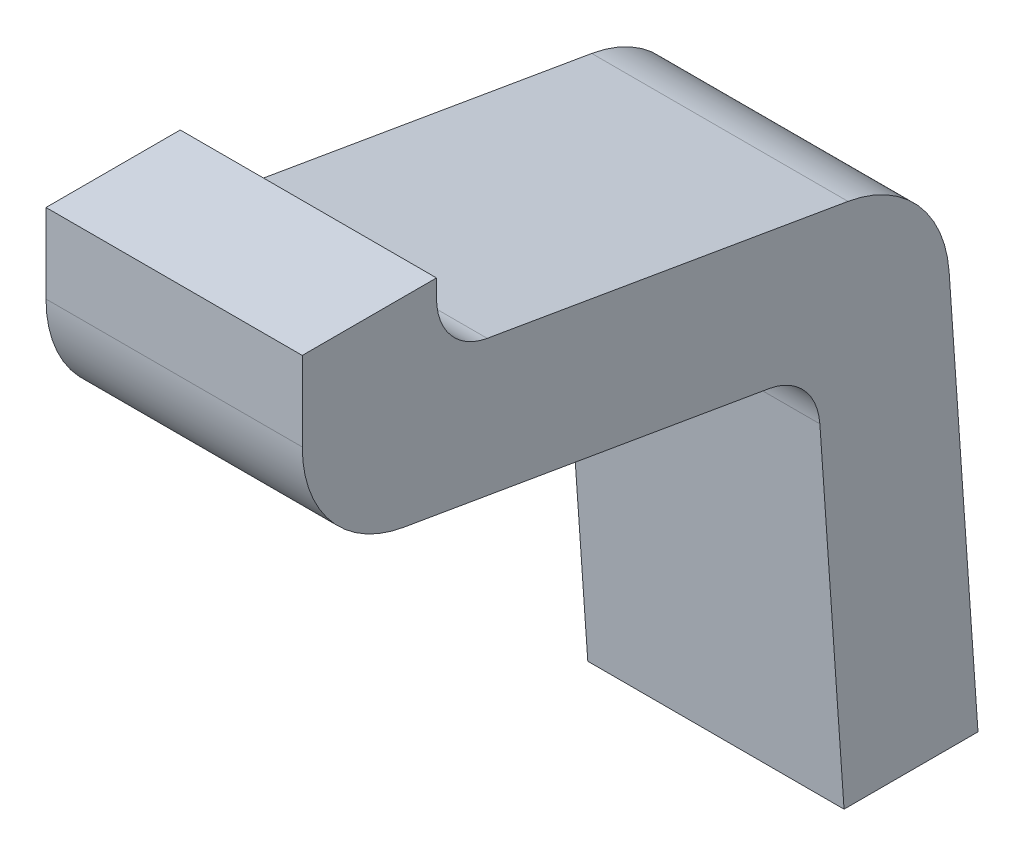
ISO-10303-21;
HEADER;
FILE_DESCRIPTION(('STEP AP214'),'2;1');
FILE_NAME('part.step','',(''),(''),'','','');
FILE_SCHEMA(('AUTOMOTIVE_DESIGN { 1 0 10303 214 1 1 1 1 }'));
ENDSEC;
DATA;
#1=APPLICATION_CONTEXT('core data for automotive mechanical design processes');
#2=APPLICATION_PROTOCOL_DEFINITION('international standard','automotive_design',2000,#1);
#3=PRODUCT_CONTEXT('',#1,'mechanical');
#4=PRODUCT('Part','Part','',(#3));
#5=PRODUCT_RELATED_PRODUCT_CATEGORY('part','',(#4));
#6=PRODUCT_DEFINITION_FORMATION('','',#4);
#7=PRODUCT_DEFINITION_CONTEXT('part definition',#1,'design');
#8=PRODUCT_DEFINITION('design','',#6,#7);
#9=PRODUCT_DEFINITION_SHAPE('','',#8);
#10=(LENGTH_UNIT() NAMED_UNIT(*) SI_UNIT(.MILLI.,.METRE.));
#11=(NAMED_UNIT(*) PLANE_ANGLE_UNIT() SI_UNIT($,.RADIAN.));
#12=(NAMED_UNIT(*) SI_UNIT($,.STERADIAN.) SOLID_ANGLE_UNIT());
#13=UNCERTAINTY_MEASURE_WITH_UNIT(LENGTH_MEASURE(1.E-05),#10,'distance_accuracy_value','');
#14=(GEOMETRIC_REPRESENTATION_CONTEXT(3) GLOBAL_UNCERTAINTY_ASSIGNED_CONTEXT((#13)) GLOBAL_UNIT_ASSIGNED_CONTEXT((#10,
#11,#12)) REPRESENTATION_CONTEXT('',''));
#15=CARTESIAN_POINT('',(0.,0.,0.));
#16=DIRECTION('',(0.,0.,1.));
#17=DIRECTION('',(1.,0.,0.));
#18=AXIS2_PLACEMENT_3D('',#15,#16,#17);
#19=CARTESIAN_POINT('',(-2.75,-3.,0.));
#20=DIRECTION('',(0.,-1.,0.));
#21=DIRECTION('',(1.,0.,0.));
#22=AXIS2_PLACEMENT_3D('',#19,#20,#21);
#23=PLANE('',#22);
#24=DIRECTION('',(1.,0.,0.));
#25=VECTOR('',#24,1.);
#26=CARTESIAN_POINT('',(-0.635,-3.,0.219534775679777));
#27=LINE('',#26,#25);
#28=CARTESIAN_POINT('',(-2.75,-3.,0.219534775679777));
#29=VERTEX_POINT('',#28);
#30=CARTESIAN_POINT('',(-2.33,-3.,0.219534775679777));
#31=VERTEX_POINT('',#30);
#32=EDGE_CURVE('E11',#29,#31,#27,.T.);
#33=ORIENTED_EDGE('',*,*,#32,.F.);
#34=DIRECTION('',(0.,0.,1.));
#35=VECTOR('',#34,1.);
#36=CARTESIAN_POINT('',(-2.75,-3.,0.));
#37=LINE('',#36,#35);
#38=CARTESIAN_POINT('',(-2.75,-3.,0.));
#39=VERTEX_POINT('',#38);
#40=EDGE_CURVE('E24',#39,#29,#37,.T.);
#41=ORIENTED_EDGE('',*,*,#40,.F.);
#42=DIRECTION('',(1.,0.,0.));
#43=VECTOR('',#42,1.);
#44=CARTESIAN_POINT('',(-2.75,-3.,0.));
#45=LINE('',#44,#43);
#46=CARTESIAN_POINT('',(-2.33,-3.,0.));
#47=VERTEX_POINT('',#46);
#48=EDGE_CURVE('E199',#39,#47,#45,.T.);
#49=ORIENTED_EDGE('',*,*,#48,.T.);
#50=DIRECTION('',(0.,0.,1.));
#51=VECTOR('',#50,1.);
#52=CARTESIAN_POINT('',(-2.33,-3.,0.));
#53=LINE('',#52,#51);
#54=EDGE_CURVE('E197',#47,#31,#53,.T.);
#55=ORIENTED_EDGE('',*,*,#54,.T.);
#56=EDGE_LOOP('',(#33,#41,#49,#55));
#57=FACE_BOUND('',#56,.T.);
#58=ADVANCED_FACE('F17',(#57),#23,.T.);
#59=CARTESIAN_POINT('',(1.48,-2.167034018033,0.0582466555763446));
#60=DIRECTION('',(0.,0.985646729541637,-0.168820983719071));
#61=DIRECTION('',(0.,0.168820983719071,0.985646729541637));
#62=AXIS2_PLACEMENT_3D('',#59,#60,#61);
#63=PLANE('',#62);
#64=DIRECTION('',(1.,0.,0.));
#65=VECTOR('',#64,1.);
#66=CARTESIAN_POINT('',(1.48,-2.140521076001,0.213040177260404));
#67=LINE('',#66,#65);
#68=CARTESIAN_POINT('',(-2.75,-2.140521076001,0.213040177260404));
#69=VERTEX_POINT('',#68);
#70=CARTESIAN_POINT('',(-2.33,-2.140521076001,0.213040177260404));
#71=VERTEX_POINT('',#70);
#72=EDGE_CURVE('E195',#69,#71,#67,.T.);
#73=ORIENTED_EDGE('',*,*,#72,.F.);
#74=DIRECTION('',(0.,0.168820983719071,0.985646729541637));
#75=VECTOR('',#74,1.);
#76=CARTESIAN_POINT('',(-2.75,-2.098248487251,0.459845034887286));
#77=LINE('',#76,#75);
#78=CARTESIAN_POINT('',(-2.75,-2.039236384596,0.804382098371907));
#79=VERTEX_POINT('',#78);
#80=EDGE_CURVE('E193',#69,#79,#77,.T.);
#81=ORIENTED_EDGE('',*,*,#80,.T.);
#82=DIRECTION('',(-1.,0.,0.));
#83=VECTOR('',#82,1.);
#84=CARTESIAN_POINT('',(1.48,-2.039236384596,0.804382098371907));
#85=LINE('',#84,#83);
#86=CARTESIAN_POINT('',(-2.33,-2.039236384596,0.804382098371907));
#87=VERTEX_POINT('',#86);
#88=EDGE_CURVE('E190',#87,#79,#85,.T.);
#89=ORIENTED_EDGE('',*,*,#88,.F.);
#90=DIRECTION('',(0.,-0.168820983719071,-0.985646729541637));
#91=VECTOR('',#90,1.);
#92=CARTESIAN_POINT('',(-2.33,-2.183750060882,-0.0393485165548266));
#93=LINE('',#92,#91);
#94=EDGE_CURVE('E187',#87,#71,#93,.T.);
#95=ORIENTED_EDGE('',*,*,#94,.T.);
#96=EDGE_LOOP('',(#73,#81,#89,#95));
#97=FACE_BOUND('',#96,.T.);
#98=ADVANCED_FACE('F243',(#97),#63,.T.);
#99=CARTESIAN_POINT('',(1.48,-2.182310685783,0.276713182583246));
#100=DIRECTION('',(0.,-0.069756473744126,0.997564050259824));
#101=DIRECTION('',(0.,-0.997564050259824,-0.069756473744126));
#102=AXIS2_PLACEMENT_3D('',#99,#100,#101);
#103=PLANE('',#102);
#104=DIRECTION('',(1.,0.,0.));
#105=VECTOR('',#104,1.);
#106=CARTESIAN_POINT('',(1.48,-2.433240926539,0.259166430826985));
#107=LINE('',#106,#105);
#108=CARTESIAN_POINT('',(-2.75,-2.433240926539,0.259166430826985));
#109=VERTEX_POINT('',#108);
#110=CARTESIAN_POINT('',(-2.33,-2.433240926539,0.259166430826985));
#111=VERTEX_POINT('',#110);
#112=EDGE_CURVE('E185',#109,#111,#107,.T.);
#113=ORIENTED_EDGE('',*,*,#112,.F.);
#114=DIRECTION('',(0.,-0.997564050259824,-0.069756473744126));
#115=VECTOR('',#114,1.);
#116=CARTESIAN_POINT('',(-2.75,0.386608426345868,0.456349506235173));
#117=LINE('',#116,#115);
#118=EDGE_CURVE('E183',#109,#29,#117,.T.);
#119=ORIENTED_EDGE('',*,*,#118,.T.);
#120=ORIENTED_EDGE('',*,*,#32,.T.);
#121=DIRECTION('',(0.,0.997564050259824,0.069756473744126));
#122=VECTOR('',#121,1.);
#123=CARTESIAN_POINT('',(-2.33,-2.598793676766,0.247589854795074));
#124=LINE('',#123,#122);
#125=EDGE_CURVE('E181',#31,#111,#124,.T.);
#126=ORIENTED_EDGE('',*,*,#125,.T.);
#127=EDGE_LOOP('',(#113,#119,#120,#126));
#128=FACE_BOUND('',#127,.T.);
#129=ADVANCED_FACE('F205',(#128),#103,.T.);
#130=CARTESIAN_POINT('',(1.48,-2.21054449521,1.1075));
#131=DIRECTION('',(0.,-0.985646729541637,0.168820983719071));
#132=DIRECTION('',(0.,-0.168820983719071,-0.985646729541637));
#133=AXIS2_PLACEMENT_3D('',#130,#131,#132);
#134=PLANE('',#133);
#135=DIRECTION('',(1.,0.,0.));
#136=VECTOR('',#135,1.);
#137=CARTESIAN_POINT('',(-0.53,-2.239017264402,0.941264196743814));
#138=LINE('',#137,#136);
#139=CARTESIAN_POINT('',(-2.75,-2.239017264402,0.941264196743814));
#140=VERTEX_POINT('',#139);
#141=CARTESIAN_POINT('',(-2.33,-2.239017264402,0.941264196743814));
#142=VERTEX_POINT('',#141);
#143=EDGE_CURVE('E179',#140,#142,#138,.T.);
#144=ORIENTED_EDGE('',*,*,#143,.F.);
#145=DIRECTION('',(0.,-0.168820983719071,-0.985646729541637));
#146=VECTOR('',#145,1.);
#147=CARTESIAN_POINT('',(-2.75,-2.228435679277,1.003043867385));
#148=LINE('',#147,#146);
#149=CARTESIAN_POINT('',(-2.75,-2.341651900959,0.342040737481061));
#150=VERTEX_POINT('',#149);
#151=EDGE_CURVE('E177',#140,#150,#148,.T.);
#152=ORIENTED_EDGE('',*,*,#151,.T.);
#153=DIRECTION('',(-1.,0.,0.));
#154=VECTOR('',#153,1.);
#155=CARTESIAN_POINT('',(1.48,-2.341651900959,0.342040737481061));
#156=LINE('',#155,#154);
#157=CARTESIAN_POINT('',(-2.33,-2.341651900959,0.342040737481061));
#158=VERTEX_POINT('',#157);
#159=EDGE_CURVE('E174',#158,#150,#156,.T.);
#160=ORIENTED_EDGE('',*,*,#159,.F.);
#161=DIRECTION('',(0.,0.168820983719071,0.985646729541637));
#162=VECTOR('',#161,1.);
#163=CARTESIAN_POINT('',(-2.33,-2.313937252909,0.503850315942545));
#164=LINE('',#163,#162);
#165=EDGE_CURVE('E171',#158,#142,#164,.T.);
#166=ORIENTED_EDGE('',*,*,#165,.T.);
#167=EDGE_LOOP('',(#144,#152,#160,#166));
#168=FACE_BOUND('',#167,.T.);
#169=ADVANCED_FACE('F234',(#168),#134,.T.);
#170=CARTESIAN_POINT('',(1.48,-2.440216573913,0.358922835852968));
#171=DIRECTION('',(-1.,0.,0.));
#172=DIRECTION('',(0.,0.670949139623343,-0.741503372911207));
#173=AXIS2_PLACEMENT_3D('',#170,#171,#172);
#174=CYLINDRICAL_SURFACE('',#173,0.1);
#175=CARTESIAN_POINT('',(-2.33,-2.440216573913,0.358922835852968));
#176=DIRECTION('',(1.,0.,0.));
#177=DIRECTION('',(0.,0.670949139623343,-0.741503372911207));
#178=AXIS2_PLACEMENT_3D('',#175,#176,#177);
#179=CIRCLE('',#178,0.1);
#180=EDGE_CURVE('E168',#111,#158,#179,.T.);
#181=ORIENTED_EDGE('',*,*,#180,.T.);
#182=ORIENTED_EDGE('',*,*,#159,.T.);
#183=CARTESIAN_POINT('',(-2.75,-2.440216573913,0.358922835852968));
#184=DIRECTION('',(-1.,0.,0.));
#185=DIRECTION('',(0.,0.670949139623343,-0.741503372911207));
#186=AXIS2_PLACEMENT_3D('',#183,#184,#185);
#187=CIRCLE('',#186,0.1);
#188=EDGE_CURVE('E165',#150,#109,#187,.T.);
#189=ORIENTED_EDGE('',*,*,#188,.T.);
#190=ORIENTED_EDGE('',*,*,#112,.T.);
#191=EDGE_LOOP('',(#181,#182,#189,#190));
#192=FACE_BOUND('',#191,.T.);
#193=ADVANCED_FACE('F209',(#192),#174,.F.);
#194=CARTESIAN_POINT('',(1.48,-1.940671711642,0.7875));
#195=DIRECTION('',(1.,0.,0.));
#196=DIRECTION('',(0.,-0.644662321018115,0.764467456377011));
#197=AXIS2_PLACEMENT_3D('',#194,#195,#196);
#198=CYLINDRICAL_SURFACE('',#197,0.1);
#199=CARTESIAN_POINT('',(-2.75,-1.940671711642,0.7875));
#200=DIRECTION('',(-1.,0.,0.));
#201=DIRECTION('',(0.,-0.644662321018115,0.764467456377011));
#202=AXIS2_PLACEMENT_3D('',#199,#200,#201);
#203=CIRCLE('',#202,0.1);
#204=CARTESIAN_POINT('',(-2.75,-1.940671711642,0.8875));
#205=VERTEX_POINT('',#204);
#206=EDGE_CURVE('E163',#79,#205,#203,.T.);
#207=ORIENTED_EDGE('',*,*,#206,.T.);
#208=DIRECTION('',(1.,0.,0.));
#209=VECTOR('',#208,1.);
#210=CARTESIAN_POINT('',(1.48,-1.940671711642,0.8875));
#211=LINE('',#210,#209);
#212=CARTESIAN_POINT('',(-2.33,-1.940671711642,0.8875));
#213=VERTEX_POINT('',#212);
#214=EDGE_CURVE('E118',#205,#213,#211,.T.);
#215=ORIENTED_EDGE('',*,*,#214,.T.);
#216=CARTESIAN_POINT('',(-2.33,-1.940671711642,0.7875));
#217=DIRECTION('',(1.,0.,0.));
#218=DIRECTION('',(0.,-0.644662321018115,0.764467456377011));
#219=AXIS2_PLACEMENT_3D('',#216,#217,#218);
#220=CIRCLE('',#219,0.1);
#221=EDGE_CURVE('E159',#213,#87,#220,.T.);
#222=ORIENTED_EDGE('',*,*,#221,.T.);
#223=ORIENTED_EDGE('',*,*,#88,.T.);
#224=EDGE_LOOP('',(#207,#215,#222,#223));
#225=FACE_BOUND('',#224,.T.);
#226=ADVANCED_FACE('F224',(#225),#198,.F.);
#227=CARTESIAN_POINT('',(1.48,-3.,0.));
#228=DIRECTION('',(0.,0.069756473744125,-0.997564050259824));
#229=DIRECTION('',(0.,0.997564050259824,0.069756473744125));
#230=AXIS2_PLACEMENT_3D('',#227,#228,#229);
#231=PLANE('',#230);
#232=DIRECTION('',(-1.,0.,0.));
#233=VECTOR('',#232,1.);
#234=CARTESIAN_POINT('',(1.48,-2.323699127161,0.0472915639522531));
#235=LINE('',#234,#233);
#236=CARTESIAN_POINT('',(-2.33,-2.323699127161,0.0472915639522531));
#237=VERTEX_POINT('',#236);
#238=CARTESIAN_POINT('',(-2.75,-2.323699127161,0.0472915639522532));
#239=VERTEX_POINT('',#238);
#240=EDGE_CURVE('E157',#237,#239,#235,.T.);
#241=ORIENTED_EDGE('',*,*,#240,.F.);
#242=DIRECTION('',(0.,-0.997564050259824,-0.069756473744125));
#243=VECTOR('',#242,1.);
#244=CARTESIAN_POINT('',(-2.33,-3.,0.));
#245=LINE('',#244,#243);
#246=EDGE_CURVE('E154',#237,#47,#245,.T.);
#247=ORIENTED_EDGE('',*,*,#246,.T.);
#248=ORIENTED_EDGE('',*,*,#48,.F.);
#249=DIRECTION('',(0.,0.997564050259824,0.069756473744125));
#250=VECTOR('',#249,1.);
#251=CARTESIAN_POINT('',(-2.75,-0.0145978968876445,0.208759651440098));
#252=LINE('',#251,#250);
#253=EDGE_CURVE('E151',#39,#239,#252,.T.);
#254=ORIENTED_EDGE('',*,*,#253,.T.);
#255=EDGE_LOOP('',(#241,#247,#248,#254));
#256=FACE_BOUND('',#255,.T.);
#257=ADVANCED_FACE('F231',(#256),#231,.T.);
#258=CARTESIAN_POINT('',(1.48,-2.33765042191,0.246804374004218));
#259=DIRECTION('',(-1.,0.,0.));
#260=DIRECTION('',(0.,0.670949139623343,-0.741503372911206));
#261=AXIS2_PLACEMENT_3D('',#258,#259,#260);
#262=CYLINDRICAL_SURFACE('',#261,0.2);
#263=CARTESIAN_POINT('',(-2.75,-2.33765042191,0.246804374004218));
#264=DIRECTION('',(1.,0.,0.));
#265=DIRECTION('',(0.,0.670949139623343,-0.741503372911206));
#266=AXIS2_PLACEMENT_3D('',#263,#264,#265);
#267=CIRCLE('',#266,0.2);
#268=EDGE_CURVE('E148',#239,#69,#267,.T.);
#269=ORIENTED_EDGE('',*,*,#268,.T.);
#270=ORIENTED_EDGE('',*,*,#72,.T.);
#271=CARTESIAN_POINT('',(-2.33,-2.33765042191,0.246804374004218));
#272=DIRECTION('',(-1.,0.,0.));
#273=DIRECTION('',(0.,0.670949139623343,-0.741503372911206));
#274=AXIS2_PLACEMENT_3D('',#271,#272,#273);
#275=CIRCLE('',#274,0.2);
#276=EDGE_CURVE('E145',#71,#237,#275,.T.);
#277=ORIENTED_EDGE('',*,*,#276,.T.);
#278=ORIENTED_EDGE('',*,*,#240,.T.);
#279=EDGE_LOOP('',(#269,#270,#277,#278));
#280=FACE_BOUND('',#279,.T.);
#281=ADVANCED_FACE('F228',(#280),#262,.T.);
#282=CARTESIAN_POINT('',(-0.53,-2.041887918493,0.9075));
#283=DIRECTION('',(-1.,0.,0.));
#284=DIRECTION('',(0.,-0.644662321018115,0.764467456377011));
#285=AXIS2_PLACEMENT_3D('',#282,#283,#284);
#286=CYLINDRICAL_SURFACE('',#285,0.2);
#287=CARTESIAN_POINT('',(-2.75,-2.041887918493,0.9075));
#288=DIRECTION('',(1.,0.,0.));
#289=DIRECTION('',(0.,-0.644662321018115,0.764467456377011));
#290=AXIS2_PLACEMENT_3D('',#287,#288,#289);
#291=CIRCLE('',#290,0.2);
#292=CARTESIAN_POINT('',(-2.75,-2.041887918493,1.1075));
#293=VERTEX_POINT('',#292);
#294=EDGE_CURVE('E142',#293,#140,#291,.T.);
#295=ORIENTED_EDGE('',*,*,#294,.T.);
#296=ORIENTED_EDGE('',*,*,#143,.T.);
#297=CARTESIAN_POINT('',(-2.33,-2.041887918493,0.9075));
#298=DIRECTION('',(-1.,0.,0.));
#299=DIRECTION('',(0.,-0.644662321018115,0.764467456377011));
#300=AXIS2_PLACEMENT_3D('',#297,#298,#299);
#301=CIRCLE('',#300,0.2);
#302=CARTESIAN_POINT('',(-2.33,-2.041887918493,1.1075));
#303=VERTEX_POINT('',#302);
#304=EDGE_CURVE('E140',#142,#303,#301,.T.);
#305=ORIENTED_EDGE('',*,*,#304,.T.);
#306=DIRECTION('',(-1.,0.,0.));
#307=VECTOR('',#306,1.);
#308=CARTESIAN_POINT('',(-0.53,-2.041887918493,1.1075));
#309=LINE('',#308,#307);
#310=EDGE_CURVE('E137',#303,#293,#309,.T.);
#311=ORIENTED_EDGE('',*,*,#310,.T.);
#312=EDGE_LOOP('',(#295,#296,#305,#311));
#313=FACE_BOUND('',#312,.T.);
#314=ADVANCED_FACE('F213',(#313),#286,.T.);
#315=CARTESIAN_POINT('',(-2.54,0.,1.1075));
#316=DIRECTION('',(0.,0.,1.));
#317=DIRECTION('',(1.,0.,0.));
#318=AXIS2_PLACEMENT_3D('',#315,#316,#317);
#319=PLANE('',#318);
#320=DIRECTION('',(-1.,0.,0.));
#321=VECTOR('',#320,1.);
#322=CARTESIAN_POINT('',(-0.53,-1.911915038984,1.1075));
#323=LINE('',#322,#321);
#324=CARTESIAN_POINT('',(-2.33,-1.911915038984,1.1075));
#325=VERTEX_POINT('',#324);
#326=CARTESIAN_POINT('',(-2.75,-1.911915038984,1.1075));
#327=VERTEX_POINT('',#326);
#328=EDGE_CURVE('E135',#325,#327,#323,.T.);
#329=ORIENTED_EDGE('',*,*,#328,.T.);
#330=DIRECTION('',(0.,-1.,0.));
#331=VECTOR('',#330,1.);
#332=CARTESIAN_POINT('',(-2.75,3.,1.1075));
#333=LINE('',#332,#331);
#334=EDGE_CURVE('E126',#327,#293,#333,.T.);
#335=ORIENTED_EDGE('',*,*,#334,.T.);
#336=ORIENTED_EDGE('',*,*,#310,.F.);
#337=DIRECTION('',(0.,1.,0.));
#338=VECTOR('',#337,1.);
#339=CARTESIAN_POINT('',(-2.33,-3.,1.1075));
#340=LINE('',#339,#338);
#341=EDGE_CURVE('E131',#303,#325,#340,.T.);
#342=ORIENTED_EDGE('',*,*,#341,.T.);
#343=EDGE_LOOP('',(#329,#335,#336,#342));
#344=FACE_BOUND('',#343,.T.);
#345=ADVANCED_FACE('F218',(#344),#319,.T.);
#346=CARTESIAN_POINT('',(-2.33,-3.,0.));
#347=DIRECTION('',(1.,0.,0.));
#348=DIRECTION('',(0.,1.,0.));
#349=AXIS2_PLACEMENT_3D('',#346,#347,#348);
#350=PLANE('',#349);
#351=DIRECTION('',(0.,0.,1.));
#352=VECTOR('',#351,1.);
#353=CARTESIAN_POINT('',(-2.33,-1.911915038984,0.643129387144308));
#354=LINE('',#353,#352);
#355=CARTESIAN_POINT('',(-2.33,-1.911915038984,0.8875));
#356=VERTEX_POINT('',#355);
#357=EDGE_CURVE('E108',#356,#325,#354,.T.);
#358=ORIENTED_EDGE('',*,*,#357,.T.);
#359=ORIENTED_EDGE('',*,*,#341,.F.);
#360=ORIENTED_EDGE('',*,*,#304,.F.);
#361=ORIENTED_EDGE('',*,*,#165,.F.);
#362=ORIENTED_EDGE('',*,*,#180,.F.);
#363=ORIENTED_EDGE('',*,*,#125,.F.);
#364=ORIENTED_EDGE('',*,*,#54,.F.);
#365=ORIENTED_EDGE('',*,*,#246,.F.);
#366=ORIENTED_EDGE('',*,*,#276,.F.);
#367=ORIENTED_EDGE('',*,*,#94,.F.);
#368=ORIENTED_EDGE('',*,*,#221,.F.);
#369=DIRECTION('',(0.,-1.,0.));
#370=VECTOR('',#369,1.);
#371=CARTESIAN_POINT('',(-2.33,-2.5125,0.8875));
#372=LINE('',#371,#370);
#373=EDGE_CURVE('E112',#356,#213,#372,.T.);
#374=ORIENTED_EDGE('',*,*,#373,.F.);
#375=EDGE_LOOP('',(#358,#359,#360,#361,#362,#363,#364,#365,#366,#367,#368,#374));
#376=FACE_BOUND('',#375,.T.);
#377=ADVANCED_FACE('F220',(#376),#350,.T.);
#378=CARTESIAN_POINT('',(1.48,-2.025,0.8875));
#379=DIRECTION('',(0.,0.,-1.));
#380=DIRECTION('',(0.,1.,0.));
#381=AXIS2_PLACEMENT_3D('',#378,#379,#380);
#382=PLANE('',#381);
#383=DIRECTION('',(1.,0.,0.));
#384=VECTOR('',#383,1.);
#385=CARTESIAN_POINT('',(1.48,-1.911915038984,0.8875));
#386=LINE('',#385,#384);
#387=CARTESIAN_POINT('',(-2.75,-1.911915038984,0.8875));
#388=VERTEX_POINT('',#387);
#389=EDGE_CURVE('E102',#388,#356,#386,.T.);
#390=ORIENTED_EDGE('',*,*,#389,.T.);
#391=ORIENTED_EDGE('',*,*,#373,.T.);
#392=ORIENTED_EDGE('',*,*,#214,.F.);
#393=DIRECTION('',(0.,1.,0.));
#394=VECTOR('',#393,1.);
#395=CARTESIAN_POINT('',(-2.75,0.4875,0.8875));
#396=LINE('',#395,#394);
#397=EDGE_CURVE('E113',#205,#388,#396,.T.);
#398=ORIENTED_EDGE('',*,*,#397,.T.);
#399=EDGE_LOOP('',(#390,#391,#392,#398));
#400=FACE_BOUND('',#399,.T.);
#401=ADVANCED_FACE('F116',(#400),#382,.T.);
#402=CARTESIAN_POINT('',(-2.75,3.,0.));
#403=DIRECTION('',(-1.,0.,0.));
#404=DIRECTION('',(0.,-1.,0.));
#405=AXIS2_PLACEMENT_3D('',#402,#403,#404);
#406=PLANE('',#405);
#407=DIRECTION('',(0.,0.,-1.));
#408=VECTOR('',#407,1.);
#409=CARTESIAN_POINT('',(-2.75,-1.911915038984,0.643129387144308));
#410=LINE('',#409,#408);
#411=EDGE_CURVE('E106',#327,#388,#410,.T.);
#412=ORIENTED_EDGE('',*,*,#411,.T.);
#413=ORIENTED_EDGE('',*,*,#397,.F.);
#414=ORIENTED_EDGE('',*,*,#206,.F.);
#415=ORIENTED_EDGE('',*,*,#80,.F.);
#416=ORIENTED_EDGE('',*,*,#268,.F.);
#417=ORIENTED_EDGE('',*,*,#253,.F.);
#418=ORIENTED_EDGE('',*,*,#40,.T.);
#419=ORIENTED_EDGE('',*,*,#118,.F.);
#420=ORIENTED_EDGE('',*,*,#188,.F.);
#421=ORIENTED_EDGE('',*,*,#151,.F.);
#422=ORIENTED_EDGE('',*,*,#294,.F.);
#423=ORIENTED_EDGE('',*,*,#334,.F.);
#424=EDGE_LOOP('',(#412,#413,#414,#415,#416,#417,#418,#419,#420,#421,#422,#423));
#425=FACE_BOUND('',#424,.T.);
#426=ADVANCED_FACE('F124',(#425),#406,.T.);
#427=CARTESIAN_POINT('',(1.48,-1.911915038984,1.286258774289));
#428=DIRECTION('',(0.,-1.,0.));
#429=DIRECTION('',(0.,0.,-1.));
#430=AXIS2_PLACEMENT_3D('',#427,#428,#429);
#431=PLANE('',#430);
#432=ORIENTED_EDGE('',*,*,#328,.F.);
#433=ORIENTED_EDGE('',*,*,#357,.F.);
#434=ORIENTED_EDGE('',*,*,#389,.F.);
#435=ORIENTED_EDGE('',*,*,#411,.F.);
#436=EDGE_LOOP('',(#432,#433,#434,#435));
#437=FACE_BOUND('',#436,.T.);
#438=ADVANCED_FACE('F104',(#437),#431,.F.);
#439=CLOSED_SHELL('',(#58,#98,#129,#169,#193,#226,#257,#281,#314,#345,#377,#401,#426,#438));
#440=MANIFOLD_SOLID_BREP('B1',#439);
#441=ADVANCED_BREP_SHAPE_REPRESENTATION('',(#18,#440),#14);
#442=SHAPE_DEFINITION_REPRESENTATION(#9,#441);
ENDSEC;
END-ISO-10303-21;
